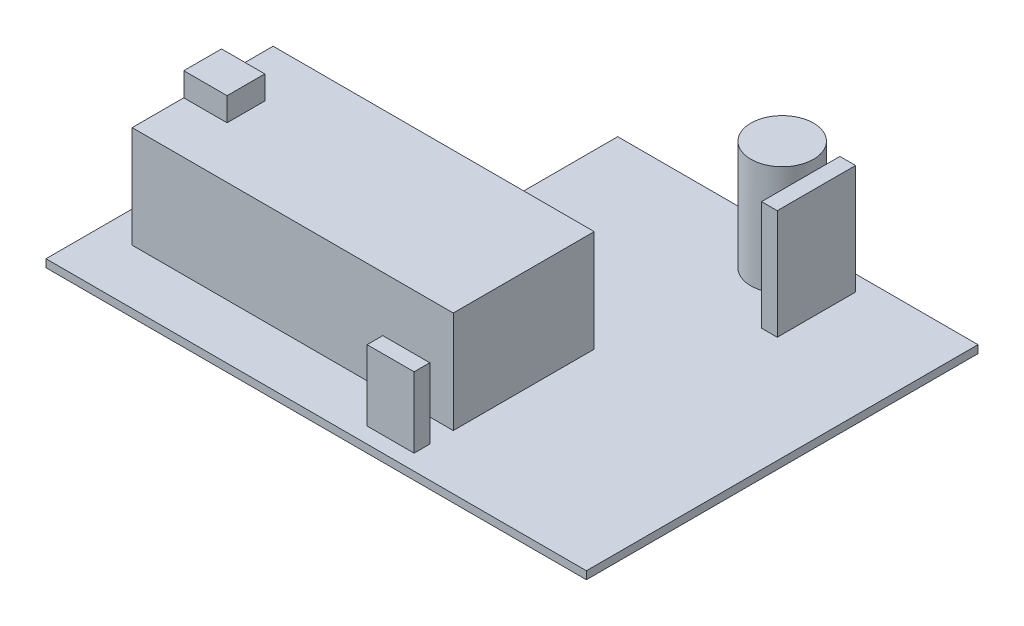
ISO-10303-21;
HEADER;
FILE_DESCRIPTION(('STEP AP214'),'2;1');
FILE_NAME('part.step','',(''),(''),'','','');
FILE_SCHEMA(('AUTOMOTIVE_DESIGN { 1 0 10303 214 1 1 1 1 }'));
ENDSEC;
DATA;
#1=APPLICATION_CONTEXT('core data for automotive mechanical design processes');
#2=APPLICATION_PROTOCOL_DEFINITION('international standard','automotive_design',2000,#1);
#3=PRODUCT_CONTEXT('',#1,'mechanical');
#4=PRODUCT('Part','Part','',(#3));
#5=PRODUCT_RELATED_PRODUCT_CATEGORY('part','',(#4));
#6=PRODUCT_DEFINITION_FORMATION('','',#4);
#7=PRODUCT_DEFINITION_CONTEXT('part definition',#1,'design');
#8=PRODUCT_DEFINITION('design','',#6,#7);
#9=PRODUCT_DEFINITION_SHAPE('','',#8);
#10=(LENGTH_UNIT() NAMED_UNIT(*) SI_UNIT(.MILLI.,.METRE.));
#11=(NAMED_UNIT(*) PLANE_ANGLE_UNIT() SI_UNIT($,.RADIAN.));
#12=(NAMED_UNIT(*) SI_UNIT($,.STERADIAN.) SOLID_ANGLE_UNIT());
#13=UNCERTAINTY_MEASURE_WITH_UNIT(LENGTH_MEASURE(1.E-05),#10,'distance_accuracy_value','');
#14=(GEOMETRIC_REPRESENTATION_CONTEXT(3) GLOBAL_UNCERTAINTY_ASSIGNED_CONTEXT((#13)) GLOBAL_UNIT_ASSIGNED_CONTEXT((#10,
#11,#12)) REPRESENTATION_CONTEXT('',''));
#15=CARTESIAN_POINT('',(0.,0.,0.));
#16=DIRECTION('',(0.,0.,1.));
#17=DIRECTION('',(1.,0.,0.));
#18=AXIS2_PLACEMENT_3D('',#15,#16,#17);
#19=CARTESIAN_POINT('',(0.,1.,0.));
#20=DIRECTION('',(0.,1.,0.));
#21=DIRECTION('',(0.,0.,1.));
#22=AXIS2_PLACEMENT_3D('',#19,#20,#21);
#23=PLANE('',#22);
#24=DIRECTION('',(1.,0.,0.));
#25=VECTOR('',#24,1.);
#26=CARTESIAN_POINT('',(0.,1.,-50.));
#27=LINE('',#26,#25);
#28=CARTESIAN_POINT('',(48.,1.,-50.));
#29=VERTEX_POINT('',#28);
#30=CARTESIAN_POINT('',(69.,1.,-50.));
#31=VERTEX_POINT('',#30);
#32=EDGE_CURVE('E313',#29,#31,#27,.T.);
#33=ORIENTED_EDGE('',*,*,#32,.F.);
#34=CARTESIAN_POINT('',(48.,1.,-46.));
#35=DIRECTION('',(0.,1.,0.));
#36=DIRECTION('',(0.,0.,1.));
#37=AXIS2_PLACEMENT_3D('',#34,#35,#36);
#38=CIRCLE('',#37,4.00000000000001);
#39=EDGE_CURVE('E58',#29,#29,#38,.T.);
#40=ORIENTED_EDGE('',*,*,#39,.F.);
#41=CARTESIAN_POINT('',(23.,1.,-50.));
#42=VERTEX_POINT('',#41);
#43=EDGE_CURVE('E309',#42,#29,#27,.T.);
#44=ORIENTED_EDGE('',*,*,#43,.F.);
#45=DIRECTION('',(0.,0.,1.));
#46=VECTOR('',#45,1.);
#47=CARTESIAN_POINT('',(23.,1.,0.));
#48=LINE('',#47,#46);
#49=CARTESIAN_POINT('',(23.,1.,-32.));
#50=VERTEX_POINT('',#49);
#51=EDGE_CURVE('E312',#42,#50,#48,.T.);
#52=ORIENTED_EDGE('',*,*,#51,.T.);
#53=DIRECTION('',(1.,0.,0.));
#54=VECTOR('',#53,1.);
#55=CARTESIAN_POINT('',(0.,1.,-32.));
#56=LINE('',#55,#54);
#57=CARTESIAN_POINT('',(0.,1.,-32.));
#58=VERTEX_POINT('',#57);
#59=EDGE_CURVE('E315',#58,#50,#56,.T.);
#60=ORIENTED_EDGE('',*,*,#59,.F.);
#61=DIRECTION('',(0.,0.,-1.));
#62=VECTOR('',#61,1.);
#63=CARTESIAN_POINT('',(0.,1.,0.));
#64=LINE('',#63,#62);
#65=CARTESIAN_POINT('',(0.,1.,0.));
#66=VERTEX_POINT('',#65);
#67=EDGE_CURVE('E318',#66,#58,#64,.T.);
#68=ORIENTED_EDGE('',*,*,#67,.F.);
#69=DIRECTION('',(1.,0.,0.));
#70=VECTOR('',#69,1.);
#71=CARTESIAN_POINT('',(0.,1.,0.));
#72=LINE('',#71,#70);
#73=CARTESIAN_POINT('',(69.,1.,0.));
#74=VERTEX_POINT('',#73);
#75=EDGE_CURVE('E321',#66,#74,#72,.T.);
#76=ORIENTED_EDGE('',*,*,#75,.T.);
#77=DIRECTION('',(0.,0.,-1.));
#78=VECTOR('',#77,1.);
#79=CARTESIAN_POINT('',(69.,1.,0.));
#80=LINE('',#79,#78);
#81=EDGE_CURVE('E323',#74,#31,#80,.T.);
#82=ORIENTED_EDGE('',*,*,#81,.T.);
#83=EDGE_LOOP('',(#33,#40,#44,#52,#60,#68,#76,#82));
#84=FACE_BOUND('',#83,.T.);
#85=DIRECTION('',(1.,0.,0.));
#86=VECTOR('',#85,1.);
#87=CARTESIAN_POINT('',(4.,1.,-7.));
#88=LINE('',#87,#86);
#89=CARTESIAN_POINT('',(4.,1.,-7.));
#90=VERTEX_POINT('',#89);
#91=CARTESIAN_POINT('',(45.,1.,-7.));
#92=VERTEX_POINT('',#91);
#93=EDGE_CURVE('E292',#90,#92,#88,.T.);
#94=ORIENTED_EDGE('',*,*,#93,.F.);
#95=DIRECTION('',(0.,0.,1.));
#96=VECTOR('',#95,1.);
#97=CARTESIAN_POINT('',(4.,1.,-25.));
#98=LINE('',#97,#96);
#99=CARTESIAN_POINT('',(4.,1.,-25.));
#100=VERTEX_POINT('',#99);
#101=EDGE_CURVE('E279',#100,#90,#98,.T.);
#102=ORIENTED_EDGE('',*,*,#101,.F.);
#103=DIRECTION('',(-1.,0.,0.));
#104=VECTOR('',#103,1.);
#105=CARTESIAN_POINT('',(4.,1.,-25.));
#106=LINE('',#105,#104);
#107=CARTESIAN_POINT('',(45.,1.,-25.));
#108=VERTEX_POINT('',#107);
#109=EDGE_CURVE('E297',#108,#100,#106,.T.);
#110=ORIENTED_EDGE('',*,*,#109,.F.);
#111=DIRECTION('',(0.,0.,-1.));
#112=VECTOR('',#111,1.);
#113=CARTESIAN_POINT('',(45.,1.,-25.));
#114=LINE('',#113,#112);
#115=EDGE_CURVE('E294',#92,#108,#114,.T.);
#116=ORIENTED_EDGE('',*,*,#115,.F.);
#117=EDGE_LOOP('',(#94,#102,#110,#116));
#118=FACE_BOUND('',#117,.T.);
#119=DIRECTION('',(-1.,0.,0.));
#120=VECTOR('',#119,1.);
#121=CARTESIAN_POINT('',(45.,1.,-4.));
#122=LINE('',#121,#120);
#123=CARTESIAN_POINT('',(45.,1.,-4.));
#124=VERTEX_POINT('',#123);
#125=CARTESIAN_POINT('',(39.,1.,-4.));
#126=VERTEX_POINT('',#125);
#127=EDGE_CURVE('E234',#124,#126,#122,.T.);
#128=ORIENTED_EDGE('',*,*,#127,.F.);
#129=DIRECTION('',(0.,0.,-1.));
#130=VECTOR('',#129,1.);
#131=CARTESIAN_POINT('',(45.,1.,-4.));
#132=LINE('',#131,#130);
#133=CARTESIAN_POINT('',(45.,1.,-2.));
#134=VERTEX_POINT('',#133);
#135=EDGE_CURVE('E219',#134,#124,#132,.T.);
#136=ORIENTED_EDGE('',*,*,#135,.F.);
#137=DIRECTION('',(1.,0.,0.));
#138=VECTOR('',#137,1.);
#139=CARTESIAN_POINT('',(45.,1.,-2.));
#140=LINE('',#139,#138);
#141=CARTESIAN_POINT('',(39.,1.,-2.));
#142=VERTEX_POINT('',#141);
#143=EDGE_CURVE('E225',#142,#134,#140,.T.);
#144=ORIENTED_EDGE('',*,*,#143,.F.);
#145=DIRECTION('',(0.,0.,1.));
#146=VECTOR('',#145,1.);
#147=CARTESIAN_POINT('',(39.,1.,-4.));
#148=LINE('',#147,#146);
#149=EDGE_CURVE('E236',#126,#142,#148,.T.);
#150=ORIENTED_EDGE('',*,*,#149,.F.);
#151=EDGE_LOOP('',(#128,#136,#144,#150));
#152=FACE_BOUND('',#151,.T.);
#153=DIRECTION('',(1.,0.,0.));
#154=VECTOR('',#153,1.);
#155=CARTESIAN_POINT('',(53.3685470889416,1.,-38.));
#156=LINE('',#155,#154);
#157=CARTESIAN_POINT('',(53.3685470889416,1.,-38.));
#158=VERTEX_POINT('',#157);
#159=CARTESIAN_POINT('',(55.3685470889416,1.,-38.));
#160=VERTEX_POINT('',#159);
#161=EDGE_CURVE('E650',#158,#160,#156,.T.);
#162=ORIENTED_EDGE('',*,*,#161,.F.);
#163=DIRECTION('',(0.,0.,1.));
#164=VECTOR('',#163,1.);
#165=CARTESIAN_POINT('',(53.3685470889416,1.,-48.));
#166=LINE('',#165,#164);
#167=CARTESIAN_POINT('',(53.3685470889416,1.,-48.));
#168=VERTEX_POINT('',#167);
#169=EDGE_CURVE('E210',#168,#158,#166,.T.);
#170=ORIENTED_EDGE('',*,*,#169,.F.);
#171=DIRECTION('',(-1.,0.,0.));
#172=VECTOR('',#171,1.);
#173=CARTESIAN_POINT('',(53.3685470889416,1.,-48.));
#174=LINE('',#173,#172);
#175=CARTESIAN_POINT('',(55.3685470889416,1.,-48.));
#176=VERTEX_POINT('',#175);
#177=EDGE_CURVE('E206',#176,#168,#174,.T.);
#178=ORIENTED_EDGE('',*,*,#177,.F.);
#179=DIRECTION('',(0.,0.,-1.));
#180=VECTOR('',#179,1.);
#181=CARTESIAN_POINT('',(55.3685470889416,1.,-48.));
#182=LINE('',#181,#180);
#183=EDGE_CURVE('E647',#160,#176,#182,.T.);
#184=ORIENTED_EDGE('',*,*,#183,.F.);
#185=EDGE_LOOP('',(#162,#170,#178,#184));
#186=FACE_BOUND('',#185,.T.);
#187=ADVANCED_FACE('F37',(#84,#118,#152,#186),#23,.T.);
#188=CARTESIAN_POINT('',(0.,1.,-50.));
#189=DIRECTION('',(0.,0.,-1.));
#190=DIRECTION('',(-1.,0.,0.));
#191=AXIS2_PLACEMENT_3D('',#188,#189,#190);
#192=PLANE('',#191);
#193=DIRECTION('',(1.,0.,0.));
#194=VECTOR('',#193,1.);
#195=CARTESIAN_POINT('',(0.,0.,-50.));
#196=LINE('',#195,#194);
#197=CARTESIAN_POINT('',(23.,0.,-50.));
#198=VERTEX_POINT('',#197);
#199=CARTESIAN_POINT('',(69.,0.,-50.));
#200=VERTEX_POINT('',#199);
#201=EDGE_CURVE('E308',#198,#200,#196,.T.);
#202=ORIENTED_EDGE('',*,*,#201,.F.);
#203=DIRECTION('',(0.,-1.,0.));
#204=VECTOR('',#203,1.);
#205=CARTESIAN_POINT('',(23.,1.,-50.));
#206=LINE('',#205,#204);
#207=EDGE_CURVE('E11',#42,#198,#206,.T.);
#208=ORIENTED_EDGE('',*,*,#207,.F.);
#209=ORIENTED_EDGE('',*,*,#43,.T.);
#210=ORIENTED_EDGE('',*,*,#32,.T.);
#211=DIRECTION('',(0.,-1.,0.));
#212=VECTOR('',#211,1.);
#213=CARTESIAN_POINT('',(69.,1.,-50.));
#214=LINE('',#213,#212);
#215=EDGE_CURVE('E326',#31,#200,#214,.T.);
#216=ORIENTED_EDGE('',*,*,#215,.T.);
#217=EDGE_LOOP('',(#202,#208,#209,#210,#216));
#218=FACE_BOUND('',#217,.T.);
#219=ADVANCED_FACE('F39',(#218),#192,.T.);
#220=CARTESIAN_POINT('',(23.,1.,0.));
#221=DIRECTION('',(1.,0.,0.));
#222=DIRECTION('',(0.,0.,-1.));
#223=AXIS2_PLACEMENT_3D('',#220,#221,#222);
#224=PLANE('',#223);
#225=DIRECTION('',(0.,0.,1.));
#226=VECTOR('',#225,1.);
#227=CARTESIAN_POINT('',(23.,0.,0.));
#228=LINE('',#227,#226);
#229=CARTESIAN_POINT('',(23.,0.,-32.));
#230=VERTEX_POINT('',#229);
#231=EDGE_CURVE('E329',#198,#230,#228,.T.);
#232=ORIENTED_EDGE('',*,*,#231,.T.);
#233=DIRECTION('',(0.,-1.,0.));
#234=VECTOR('',#233,1.);
#235=CARTESIAN_POINT('',(23.,1.,-32.));
#236=LINE('',#235,#234);
#237=EDGE_CURVE('E45',#50,#230,#236,.T.);
#238=ORIENTED_EDGE('',*,*,#237,.F.);
#239=ORIENTED_EDGE('',*,*,#51,.F.);
#240=ORIENTED_EDGE('',*,*,#207,.T.);
#241=EDGE_LOOP('',(#232,#238,#239,#240));
#242=FACE_BOUND('',#241,.T.);
#243=ADVANCED_FACE('F358',(#242),#224,.F.);
#244=CARTESIAN_POINT('',(0.,1.,-32.));
#245=DIRECTION('',(0.,0.,-1.));
#246=DIRECTION('',(-1.,0.,0.));
#247=AXIS2_PLACEMENT_3D('',#244,#245,#246);
#248=PLANE('',#247);
#249=DIRECTION('',(1.,0.,0.));
#250=VECTOR('',#249,1.);
#251=CARTESIAN_POINT('',(0.,0.,-32.));
#252=LINE('',#251,#250);
#253=CARTESIAN_POINT('',(0.,0.,-32.));
#254=VERTEX_POINT('',#253);
#255=EDGE_CURVE('E332',#254,#230,#252,.T.);
#256=ORIENTED_EDGE('',*,*,#255,.F.);
#257=DIRECTION('',(0.,-1.,0.));
#258=VECTOR('',#257,1.);
#259=CARTESIAN_POINT('',(0.,1.,-32.));
#260=LINE('',#259,#258);
#261=EDGE_CURVE('E349',#58,#254,#260,.T.);
#262=ORIENTED_EDGE('',*,*,#261,.F.);
#263=ORIENTED_EDGE('',*,*,#59,.T.);
#264=ORIENTED_EDGE('',*,*,#237,.T.);
#265=EDGE_LOOP('',(#256,#262,#263,#264));
#266=FACE_BOUND('',#265,.T.);
#267=ADVANCED_FACE('F353',(#266),#248,.T.);
#268=CARTESIAN_POINT('',(0.,1.,0.));
#269=DIRECTION('',(-1.,0.,0.));
#270=DIRECTION('',(0.,0.,1.));
#271=AXIS2_PLACEMENT_3D('',#268,#269,#270);
#272=PLANE('',#271);
#273=DIRECTION('',(0.,0.,-1.));
#274=VECTOR('',#273,1.);
#275=CARTESIAN_POINT('',(0.,0.,0.));
#276=LINE('',#275,#274);
#277=CARTESIAN_POINT('',(0.,0.,0.));
#278=VERTEX_POINT('',#277);
#279=EDGE_CURVE('E335',#278,#254,#276,.T.);
#280=ORIENTED_EDGE('',*,*,#279,.F.);
#281=DIRECTION('',(0.,-1.,0.));
#282=VECTOR('',#281,1.);
#283=CARTESIAN_POINT('',(0.,1.,0.));
#284=LINE('',#283,#282);
#285=EDGE_CURVE('E347',#66,#278,#284,.T.);
#286=ORIENTED_EDGE('',*,*,#285,.F.);
#287=ORIENTED_EDGE('',*,*,#67,.T.);
#288=ORIENTED_EDGE('',*,*,#261,.T.);
#289=EDGE_LOOP('',(#280,#286,#287,#288));
#290=FACE_BOUND('',#289,.T.);
#291=ADVANCED_FACE('F366',(#290),#272,.T.);
#292=CARTESIAN_POINT('',(0.,1.,0.));
#293=DIRECTION('',(0.,0.,-1.));
#294=DIRECTION('',(-1.,0.,0.));
#295=AXIS2_PLACEMENT_3D('',#292,#293,#294);
#296=PLANE('',#295);
#297=DIRECTION('',(1.,0.,0.));
#298=VECTOR('',#297,1.);
#299=CARTESIAN_POINT('',(0.,0.,0.));
#300=LINE('',#299,#298);
#301=CARTESIAN_POINT('',(69.,0.,0.));
#302=VERTEX_POINT('',#301);
#303=EDGE_CURVE('E338',#278,#302,#300,.T.);
#304=ORIENTED_EDGE('',*,*,#303,.T.);
#305=DIRECTION('',(0.,-1.,0.));
#306=VECTOR('',#305,1.);
#307=CARTESIAN_POINT('',(69.,1.,0.));
#308=LINE('',#307,#306);
#309=EDGE_CURVE('E344',#74,#302,#308,.T.);
#310=ORIENTED_EDGE('',*,*,#309,.F.);
#311=ORIENTED_EDGE('',*,*,#75,.F.);
#312=ORIENTED_EDGE('',*,*,#285,.T.);
#313=EDGE_LOOP('',(#304,#310,#311,#312));
#314=FACE_BOUND('',#313,.T.);
#315=ADVANCED_FACE('F380',(#314),#296,.F.);
#316=CARTESIAN_POINT('',(69.,1.,0.));
#317=DIRECTION('',(-1.,0.,0.));
#318=DIRECTION('',(0.,0.,1.));
#319=AXIS2_PLACEMENT_3D('',#316,#317,#318);
#320=PLANE('',#319);
#321=DIRECTION('',(0.,0.,-1.));
#322=VECTOR('',#321,1.);
#323=CARTESIAN_POINT('',(69.,0.,0.));
#324=LINE('',#323,#322);
#325=EDGE_CURVE('E340',#302,#200,#324,.T.);
#326=ORIENTED_EDGE('',*,*,#325,.T.);
#327=ORIENTED_EDGE('',*,*,#215,.F.);
#328=ORIENTED_EDGE('',*,*,#81,.F.);
#329=ORIENTED_EDGE('',*,*,#309,.T.);
#330=EDGE_LOOP('',(#326,#327,#328,#329));
#331=FACE_BOUND('',#330,.T.);
#332=ADVANCED_FACE('F376',(#331),#320,.F.);
#333=CARTESIAN_POINT('',(0.,0.,0.));
#334=DIRECTION('',(0.,1.,0.));
#335=DIRECTION('',(0.,0.,1.));
#336=AXIS2_PLACEMENT_3D('',#333,#334,#335);
#337=PLANE('',#336);
#338=ORIENTED_EDGE('',*,*,#201,.T.);
#339=ORIENTED_EDGE('',*,*,#325,.F.);
#340=ORIENTED_EDGE('',*,*,#303,.F.);
#341=ORIENTED_EDGE('',*,*,#279,.T.);
#342=ORIENTED_EDGE('',*,*,#255,.T.);
#343=ORIENTED_EDGE('',*,*,#231,.F.);
#344=EDGE_LOOP('',(#338,#339,#340,#341,#342,#343));
#345=FACE_BOUND('',#344,.T.);
#346=ADVANCED_FACE('F361',(#345),#337,.F.);
#347=CARTESIAN_POINT('',(4.,14.,-25.));
#348=DIRECTION('',(1.,0.,0.));
#349=DIRECTION('',(0.,0.,-1.));
#350=AXIS2_PLACEMENT_3D('',#347,#348,#349);
#351=PLANE('',#350);
#352=ORIENTED_EDGE('',*,*,#101,.T.);
#353=DIRECTION('',(0.,-1.,0.));
#354=VECTOR('',#353,1.);
#355=CARTESIAN_POINT('',(4.,14.,-7.));
#356=LINE('',#355,#354);
#357=CARTESIAN_POINT('',(4.,14.,-7.));
#358=VERTEX_POINT('',#357);
#359=EDGE_CURVE('E306',#358,#90,#356,.T.);
#360=ORIENTED_EDGE('',*,*,#359,.F.);
#361=DIRECTION('',(0.,0.,1.));
#362=VECTOR('',#361,1.);
#363=CARTESIAN_POINT('',(4.,14.,-25.));
#364=LINE('',#363,#362);
#365=CARTESIAN_POINT('',(4.,14.,-13.5914102064778));
#366=VERTEX_POINT('',#365);
#367=EDGE_CURVE('E283',#366,#358,#364,.T.);
#368=ORIENTED_EDGE('',*,*,#367,.F.);
#369=DIRECTION('',(0.,-1.,0.));
#370=VECTOR('',#369,1.);
#371=CARTESIAN_POINT('',(4.,17.,-13.5914102064778));
#372=LINE('',#371,#370);
#373=CARTESIAN_POINT('',(4.,17.,-13.5914102064778));
#374=VERTEX_POINT('',#373);
#375=EDGE_CURVE('E276',#374,#366,#372,.T.);
#376=ORIENTED_EDGE('',*,*,#375,.F.);
#377=DIRECTION('',(0.,0.,1.));
#378=VECTOR('',#377,1.);
#379=CARTESIAN_POINT('',(4.,17.,-18.4085897935222));
#380=LINE('',#379,#378);
#381=CARTESIAN_POINT('',(4.,17.,-18.4085897935222));
#382=VERTEX_POINT('',#381);
#383=EDGE_CURVE('E250',#382,#374,#380,.T.);
#384=ORIENTED_EDGE('',*,*,#383,.F.);
#385=DIRECTION('',(0.,-1.,0.));
#386=VECTOR('',#385,1.);
#387=CARTESIAN_POINT('',(4.,17.,-18.4085897935222));
#388=LINE('',#387,#386);
#389=CARTESIAN_POINT('',(4.,14.,-18.4085897935222));
#390=VERTEX_POINT('',#389);
#391=EDGE_CURVE('E260',#382,#390,#388,.T.);
#392=ORIENTED_EDGE('',*,*,#391,.T.);
#393=CARTESIAN_POINT('',(4.,14.,-25.));
#394=VERTEX_POINT('',#393);
#395=EDGE_CURVE('E280',#394,#390,#364,.T.);
#396=ORIENTED_EDGE('',*,*,#395,.F.);
#397=DIRECTION('',(0.,-1.,0.));
#398=VECTOR('',#397,1.);
#399=CARTESIAN_POINT('',(4.,14.,-25.));
#400=LINE('',#399,#398);
#401=EDGE_CURVE('E289',#394,#100,#400,.T.);
#402=ORIENTED_EDGE('',*,*,#401,.T.);
#403=EDGE_LOOP('',(#352,#360,#368,#376,#384,#392,#396,#402));
#404=FACE_BOUND('',#403,.T.);
#405=ADVANCED_FACE('F396',(#404),#351,.F.);
#406=CARTESIAN_POINT('',(4.,14.,-7.));
#407=DIRECTION('',(0.,0.,-1.));
#408=DIRECTION('',(-1.,0.,0.));
#409=AXIS2_PLACEMENT_3D('',#406,#407,#408);
#410=PLANE('',#409);
#411=ORIENTED_EDGE('',*,*,#93,.T.);
#412=DIRECTION('',(0.,-1.,0.));
#413=VECTOR('',#412,1.);
#414=CARTESIAN_POINT('',(45.,14.,-7.));
#415=LINE('',#414,#413);
#416=CARTESIAN_POINT('',(45.,14.,-7.));
#417=VERTEX_POINT('',#416);
#418=EDGE_CURVE('E303',#417,#92,#415,.T.);
#419=ORIENTED_EDGE('',*,*,#418,.F.);
#420=DIRECTION('',(1.,0.,0.));
#421=VECTOR('',#420,1.);
#422=CARTESIAN_POINT('',(4.,14.,-7.));
#423=LINE('',#422,#421);
#424=EDGE_CURVE('E282',#358,#417,#423,.T.);
#425=ORIENTED_EDGE('',*,*,#424,.F.);
#426=ORIENTED_EDGE('',*,*,#359,.T.);
#427=EDGE_LOOP('',(#411,#419,#425,#426));
#428=FACE_BOUND('',#427,.T.);
#429=ADVANCED_FACE('F402',(#428),#410,.F.);
#430=CARTESIAN_POINT('',(45.,14.,-25.));
#431=DIRECTION('',(-1.,0.,0.));
#432=DIRECTION('',(0.,0.,1.));
#433=AXIS2_PLACEMENT_3D('',#430,#431,#432);
#434=PLANE('',#433);
#435=ORIENTED_EDGE('',*,*,#115,.T.);
#436=DIRECTION('',(0.,-1.,0.));
#437=VECTOR('',#436,1.);
#438=CARTESIAN_POINT('',(45.,14.,-25.));
#439=LINE('',#438,#437);
#440=CARTESIAN_POINT('',(45.,14.,-25.));
#441=VERTEX_POINT('',#440);
#442=EDGE_CURVE('E301',#441,#108,#439,.T.);
#443=ORIENTED_EDGE('',*,*,#442,.F.);
#444=DIRECTION('',(0.,0.,-1.));
#445=VECTOR('',#444,1.);
#446=CARTESIAN_POINT('',(45.,14.,-25.));
#447=LINE('',#446,#445);
#448=EDGE_CURVE('E285',#417,#441,#447,.T.);
#449=ORIENTED_EDGE('',*,*,#448,.F.);
#450=ORIENTED_EDGE('',*,*,#418,.T.);
#451=EDGE_LOOP('',(#435,#443,#449,#450));
#452=FACE_BOUND('',#451,.T.);
#453=ADVANCED_FACE('F407',(#452),#434,.F.);
#454=CARTESIAN_POINT('',(4.,14.,-25.));
#455=DIRECTION('',(0.,0.,1.));
#456=DIRECTION('',(1.,0.,0.));
#457=AXIS2_PLACEMENT_3D('',#454,#455,#456);
#458=PLANE('',#457);
#459=ORIENTED_EDGE('',*,*,#109,.T.);
#460=ORIENTED_EDGE('',*,*,#401,.F.);
#461=DIRECTION('',(-1.,0.,0.));
#462=VECTOR('',#461,1.);
#463=CARTESIAN_POINT('',(4.,14.,-25.));
#464=LINE('',#463,#462);
#465=EDGE_CURVE('E287',#441,#394,#464,.T.);
#466=ORIENTED_EDGE('',*,*,#465,.F.);
#467=ORIENTED_EDGE('',*,*,#442,.T.);
#468=EDGE_LOOP('',(#459,#460,#466,#467));
#469=FACE_BOUND('',#468,.T.);
#470=ADVANCED_FACE('F453',(#469),#458,.F.);
#471=CARTESIAN_POINT('',(0.,14.,0.));
#472=DIRECTION('',(0.,1.,0.));
#473=DIRECTION('',(0.,0.,1.));
#474=AXIS2_PLACEMENT_3D('',#471,#472,#473);
#475=PLANE('',#474);
#476=DIRECTION('',(-1.,0.,0.));
#477=VECTOR('',#476,1.);
#478=CARTESIAN_POINT('',(4.,14.,-18.4085897935222));
#479=LINE('',#478,#477);
#480=CARTESIAN_POINT('',(9.52799134150682,14.,-18.4085897935222));
#481=VERTEX_POINT('',#480);
#482=EDGE_CURVE('E254',#481,#390,#479,.T.);
#483=ORIENTED_EDGE('',*,*,#482,.F.);
#484=DIRECTION('',(0.,0.,-1.));
#485=VECTOR('',#484,1.);
#486=CARTESIAN_POINT('',(9.52799134150682,14.,-18.4085897935222));
#487=LINE('',#486,#485);
#488=CARTESIAN_POINT('',(9.52799134150682,14.,-13.5914102064778));
#489=VERTEX_POINT('',#488);
#490=EDGE_CURVE('E263',#489,#481,#487,.T.);
#491=ORIENTED_EDGE('',*,*,#490,.F.);
#492=DIRECTION('',(1.,0.,0.));
#493=VECTOR('',#492,1.);
#494=CARTESIAN_POINT('',(4.,14.,-13.5914102064778));
#495=LINE('',#494,#493);
#496=EDGE_CURVE('E249',#366,#489,#495,.T.);
#497=ORIENTED_EDGE('',*,*,#496,.F.);
#498=ORIENTED_EDGE('',*,*,#367,.T.);
#499=ORIENTED_EDGE('',*,*,#424,.T.);
#500=ORIENTED_EDGE('',*,*,#448,.T.);
#501=ORIENTED_EDGE('',*,*,#465,.T.);
#502=ORIENTED_EDGE('',*,*,#395,.T.);
#503=EDGE_LOOP('',(#483,#491,#497,#498,#499,#500,#501,#502));
#504=FACE_BOUND('',#503,.T.);
#505=ADVANCED_FACE('F425',(#504),#475,.T.);
#506=CARTESIAN_POINT('',(4.,17.,-13.5914102064778));
#507=DIRECTION('',(0.,0.,-1.));
#508=DIRECTION('',(-1.,0.,0.));
#509=AXIS2_PLACEMENT_3D('',#506,#507,#508);
#510=PLANE('',#509);
#511=ORIENTED_EDGE('',*,*,#496,.T.);
#512=DIRECTION('',(0.,-1.,0.));
#513=VECTOR('',#512,1.);
#514=CARTESIAN_POINT('',(9.52799134150682,17.,-13.5914102064778));
#515=LINE('',#514,#513);
#516=CARTESIAN_POINT('',(9.52799134150682,17.,-13.5914102064778));
#517=VERTEX_POINT('',#516);
#518=EDGE_CURVE('E273',#517,#489,#515,.T.);
#519=ORIENTED_EDGE('',*,*,#518,.F.);
#520=DIRECTION('',(1.,0.,0.));
#521=VECTOR('',#520,1.);
#522=CARTESIAN_POINT('',(4.,17.,-13.5914102064778));
#523=LINE('',#522,#521);
#524=EDGE_CURVE('E253',#374,#517,#523,.T.);
#525=ORIENTED_EDGE('',*,*,#524,.F.);
#526=ORIENTED_EDGE('',*,*,#375,.T.);
#527=EDGE_LOOP('',(#511,#519,#525,#526));
#528=FACE_BOUND('',#527,.T.);
#529=ADVANCED_FACE('F429',(#528),#510,.F.);
#530=CARTESIAN_POINT('',(9.52799134150682,17.,-18.4085897935222));
#531=DIRECTION('',(-1.,0.,0.));
#532=DIRECTION('',(0.,0.,1.));
#533=AXIS2_PLACEMENT_3D('',#530,#531,#532);
#534=PLANE('',#533);
#535=ORIENTED_EDGE('',*,*,#490,.T.);
#536=DIRECTION('',(0.,-1.,0.));
#537=VECTOR('',#536,1.);
#538=CARTESIAN_POINT('',(9.52799134150682,17.,-18.4085897935222));
#539=LINE('',#538,#537);
#540=CARTESIAN_POINT('',(9.52799134150682,17.,-18.4085897935222));
#541=VERTEX_POINT('',#540);
#542=EDGE_CURVE('E270',#541,#481,#539,.T.);
#543=ORIENTED_EDGE('',*,*,#542,.F.);
#544=DIRECTION('',(0.,0.,-1.));
#545=VECTOR('',#544,1.);
#546=CARTESIAN_POINT('',(9.52799134150682,17.,-18.4085897935222));
#547=LINE('',#546,#545);
#548=EDGE_CURVE('E256',#517,#541,#547,.T.);
#549=ORIENTED_EDGE('',*,*,#548,.F.);
#550=ORIENTED_EDGE('',*,*,#518,.T.);
#551=EDGE_LOOP('',(#535,#543,#549,#550));
#552=FACE_BOUND('',#551,.T.);
#553=ADVANCED_FACE('F440',(#552),#534,.F.);
#554=CARTESIAN_POINT('',(4.,17.,-18.4085897935222));
#555=DIRECTION('',(0.,0.,1.));
#556=DIRECTION('',(1.,0.,0.));
#557=AXIS2_PLACEMENT_3D('',#554,#555,#556);
#558=PLANE('',#557);
#559=ORIENTED_EDGE('',*,*,#482,.T.);
#560=ORIENTED_EDGE('',*,*,#391,.F.);
#561=DIRECTION('',(-1.,0.,0.));
#562=VECTOR('',#561,1.);
#563=CARTESIAN_POINT('',(4.,17.,-18.4085897935222));
#564=LINE('',#563,#562);
#565=EDGE_CURVE('E258',#541,#382,#564,.T.);
#566=ORIENTED_EDGE('',*,*,#565,.F.);
#567=ORIENTED_EDGE('',*,*,#542,.T.);
#568=EDGE_LOOP('',(#559,#560,#566,#567));
#569=FACE_BOUND('',#568,.T.);
#570=ADVANCED_FACE('F437',(#569),#558,.F.);
#571=CARTESIAN_POINT('',(0.,17.,0.));
#572=DIRECTION('',(0.,1.,0.));
#573=DIRECTION('',(0.,0.,1.));
#574=AXIS2_PLACEMENT_3D('',#571,#572,#573);
#575=PLANE('',#574);
#576=ORIENTED_EDGE('',*,*,#383,.T.);
#577=ORIENTED_EDGE('',*,*,#524,.T.);
#578=ORIENTED_EDGE('',*,*,#548,.T.);
#579=ORIENTED_EDGE('',*,*,#565,.T.);
#580=EDGE_LOOP('',(#576,#577,#578,#579));
#581=FACE_BOUND('',#580,.T.);
#582=ADVANCED_FACE('F433',(#581),#575,.T.);
#583=CARTESIAN_POINT('',(45.,10.,-4.));
#584=DIRECTION('',(-1.,0.,0.));
#585=DIRECTION('',(0.,0.,1.));
#586=AXIS2_PLACEMENT_3D('',#583,#584,#585);
#587=PLANE('',#586);
#588=ORIENTED_EDGE('',*,*,#135,.T.);
#589=DIRECTION('',(0.,-1.,0.));
#590=VECTOR('',#589,1.);
#591=CARTESIAN_POINT('',(45.,10.,-4.));
#592=LINE('',#591,#590);
#593=CARTESIAN_POINT('',(45.,10.,-4.));
#594=VERTEX_POINT('',#593);
#595=EDGE_CURVE('E247',#594,#124,#592,.T.);
#596=ORIENTED_EDGE('',*,*,#595,.F.);
#597=DIRECTION('',(0.,0.,-1.));
#598=VECTOR('',#597,1.);
#599=CARTESIAN_POINT('',(45.,10.,-4.));
#600=LINE('',#599,#598);
#601=CARTESIAN_POINT('',(45.,10.,-2.));
#602=VERTEX_POINT('',#601);
#603=EDGE_CURVE('E221',#602,#594,#600,.T.);
#604=ORIENTED_EDGE('',*,*,#603,.F.);
#605=DIRECTION('',(0.,-1.,0.));
#606=VECTOR('',#605,1.);
#607=CARTESIAN_POINT('',(45.,10.,-2.));
#608=LINE('',#607,#606);
#609=EDGE_CURVE('E231',#602,#134,#608,.T.);
#610=ORIENTED_EDGE('',*,*,#609,.T.);
#611=EDGE_LOOP('',(#588,#596,#604,#610));
#612=FACE_BOUND('',#611,.T.);
#613=ADVANCED_FACE('F498',(#612),#587,.F.);
#614=CARTESIAN_POINT('',(45.,10.,-4.));
#615=DIRECTION('',(0.,0.,1.));
#616=DIRECTION('',(1.,0.,0.));
#617=AXIS2_PLACEMENT_3D('',#614,#615,#616);
#618=PLANE('',#617);
#619=ORIENTED_EDGE('',*,*,#127,.T.);
#620=DIRECTION('',(0.,-1.,0.));
#621=VECTOR('',#620,1.);
#622=CARTESIAN_POINT('',(39.,10.,-4.));
#623=LINE('',#622,#621);
#624=CARTESIAN_POINT('',(39.,10.,-4.));
#625=VERTEX_POINT('',#624);
#626=EDGE_CURVE('E244',#625,#126,#623,.T.);
#627=ORIENTED_EDGE('',*,*,#626,.F.);
#628=DIRECTION('',(-1.,0.,0.));
#629=VECTOR('',#628,1.);
#630=CARTESIAN_POINT('',(45.,10.,-4.));
#631=LINE('',#630,#629);
#632=EDGE_CURVE('E224',#594,#625,#631,.T.);
#633=ORIENTED_EDGE('',*,*,#632,.F.);
#634=ORIENTED_EDGE('',*,*,#595,.T.);
#635=EDGE_LOOP('',(#619,#627,#633,#634));
#636=FACE_BOUND('',#635,.T.);
#637=ADVANCED_FACE('F507',(#636),#618,.F.);
#638=CARTESIAN_POINT('',(39.,10.,-4.));
#639=DIRECTION('',(1.,0.,0.));
#640=DIRECTION('',(0.,0.,-1.));
#641=AXIS2_PLACEMENT_3D('',#638,#639,#640);
#642=PLANE('',#641);
#643=ORIENTED_EDGE('',*,*,#149,.T.);
#644=DIRECTION('',(0.,-1.,0.));
#645=VECTOR('',#644,1.);
#646=CARTESIAN_POINT('',(39.,10.,-2.));
#647=LINE('',#646,#645);
#648=CARTESIAN_POINT('',(39.,10.,-2.));
#649=VERTEX_POINT('',#648);
#650=EDGE_CURVE('E242',#649,#142,#647,.T.);
#651=ORIENTED_EDGE('',*,*,#650,.F.);
#652=DIRECTION('',(0.,0.,1.));
#653=VECTOR('',#652,1.);
#654=CARTESIAN_POINT('',(39.,10.,-4.));
#655=LINE('',#654,#653);
#656=EDGE_CURVE('E227',#625,#649,#655,.T.);
#657=ORIENTED_EDGE('',*,*,#656,.F.);
#658=ORIENTED_EDGE('',*,*,#626,.T.);
#659=EDGE_LOOP('',(#643,#651,#657,#658));
#660=FACE_BOUND('',#659,.T.);
#661=ADVANCED_FACE('F519',(#660),#642,.F.);
#662=CARTESIAN_POINT('',(45.,10.,-2.));
#663=DIRECTION('',(0.,0.,-1.));
#664=DIRECTION('',(-1.,0.,0.));
#665=AXIS2_PLACEMENT_3D('',#662,#663,#664);
#666=PLANE('',#665);
#667=ORIENTED_EDGE('',*,*,#143,.T.);
#668=ORIENTED_EDGE('',*,*,#609,.F.);
#669=DIRECTION('',(1.,0.,0.));
#670=VECTOR('',#669,1.);
#671=CARTESIAN_POINT('',(45.,10.,-2.));
#672=LINE('',#671,#670);
#673=EDGE_CURVE('E229',#649,#602,#672,.T.);
#674=ORIENTED_EDGE('',*,*,#673,.F.);
#675=ORIENTED_EDGE('',*,*,#650,.T.);
#676=EDGE_LOOP('',(#667,#668,#674,#675));
#677=FACE_BOUND('',#676,.T.);
#678=ADVANCED_FACE('F529',(#677),#666,.F.);
#679=CARTESIAN_POINT('',(0.,10.,0.));
#680=DIRECTION('',(0.,-1.,0.));
#681=DIRECTION('',(0.,0.,-1.));
#682=AXIS2_PLACEMENT_3D('',#679,#680,#681);
#683=PLANE('',#682);
#684=ORIENTED_EDGE('',*,*,#603,.T.);
#685=ORIENTED_EDGE('',*,*,#632,.T.);
#686=ORIENTED_EDGE('',*,*,#656,.T.);
#687=ORIENTED_EDGE('',*,*,#673,.T.);
#688=EDGE_LOOP('',(#684,#685,#686,#687));
#689=FACE_BOUND('',#688,.T.);
#690=ADVANCED_FACE('F540',(#689),#683,.F.);
#691=CARTESIAN_POINT('',(48.,15.,-46.));
#692=DIRECTION('',(0.,-1.,0.));
#693=DIRECTION('',(0.,0.,-1.));
#694=AXIS2_PLACEMENT_3D('',#691,#692,#693);
#695=CYLINDRICAL_SURFACE('',#694,4.00000000000001);
#696=CARTESIAN_POINT('',(48.,15.,-46.));
#697=DIRECTION('',(0.,1.,0.));
#698=DIRECTION('',(0.,0.,1.));
#699=AXIS2_PLACEMENT_3D('',#696,#697,#698);
#700=CIRCLE('',#699,4.00000000000001);
#701=CARTESIAN_POINT('',(48.,15.,-42.));
#702=VERTEX_POINT('',#701);
#703=EDGE_CURVE('E213',#702,#702,#700,.T.);
#704=ORIENTED_EDGE('',*,*,#703,.F.);
#705=EDGE_LOOP('',(#704));
#706=FACE_BOUND('',#705,.T.);
#707=ORIENTED_EDGE('',*,*,#39,.T.);
#708=EDGE_LOOP('',(#707));
#709=FACE_BOUND('',#708,.T.);
#710=ADVANCED_FACE('F551',(#706,#709),#695,.T.);
#711=CARTESIAN_POINT('',(48.,15.,-46.));
#712=DIRECTION('',(0.,1.,0.));
#713=DIRECTION('',(0.,0.,1.));
#714=AXIS2_PLACEMENT_3D('',#711,#712,#713);
#715=PLANE('',#714);
#716=ORIENTED_EDGE('',*,*,#703,.T.);
#717=EDGE_LOOP('',(#716));
#718=FACE_BOUND('',#717,.T.);
#719=ADVANCED_FACE('F570',(#718),#715,.T.);
#720=CARTESIAN_POINT('',(53.3685470889416,15.,-48.));
#721=DIRECTION('',(1.,0.,0.));
#722=DIRECTION('',(0.,0.,-1.));
#723=AXIS2_PLACEMENT_3D('',#720,#721,#722);
#724=PLANE('',#723);
#725=ORIENTED_EDGE('',*,*,#169,.T.);
#726=DIRECTION('',(0.,-1.,0.));
#727=VECTOR('',#726,1.);
#728=CARTESIAN_POINT('',(53.3685470889416,15.,-38.));
#729=LINE('',#728,#727);
#730=CARTESIAN_POINT('',(53.3685470889416,15.,-38.));
#731=VERTEX_POINT('',#730);
#732=EDGE_CURVE('E191',#731,#158,#729,.T.);
#733=ORIENTED_EDGE('',*,*,#732,.F.);
#734=DIRECTION('',(0.,0.,1.));
#735=VECTOR('',#734,1.);
#736=CARTESIAN_POINT('',(53.3685470889416,15.,-48.));
#737=LINE('',#736,#735);
#738=CARTESIAN_POINT('',(53.3685470889416,15.,-48.));
#739=VERTEX_POINT('',#738);
#740=EDGE_CURVE('E198',#739,#731,#737,.T.);
#741=ORIENTED_EDGE('',*,*,#740,.F.);
#742=DIRECTION('',(0.,-1.,0.));
#743=VECTOR('',#742,1.);
#744=CARTESIAN_POINT('',(53.3685470889416,15.,-48.));
#745=LINE('',#744,#743);
#746=EDGE_CURVE('E644',#739,#168,#745,.T.);
#747=ORIENTED_EDGE('',*,*,#746,.T.);
#748=EDGE_LOOP('',(#725,#733,#741,#747));
#749=FACE_BOUND('',#748,.T.);
#750=ADVANCED_FACE('F208',(#749),#724,.F.);
#751=CARTESIAN_POINT('',(53.3685470889416,15.,-38.));
#752=DIRECTION('',(0.,0.,-1.));
#753=DIRECTION('',(-1.,0.,0.));
#754=AXIS2_PLACEMENT_3D('',#751,#752,#753);
#755=PLANE('',#754);
#756=ORIENTED_EDGE('',*,*,#161,.T.);
#757=DIRECTION('',(0.,-1.,0.));
#758=VECTOR('',#757,1.);
#759=CARTESIAN_POINT('',(55.3685470889416,15.,-38.));
#760=LINE('',#759,#758);
#761=CARTESIAN_POINT('',(55.3685470889416,15.,-38.));
#762=VERTEX_POINT('',#761);
#763=EDGE_CURVE('E194',#762,#160,#760,.T.);
#764=ORIENTED_EDGE('',*,*,#763,.F.);
#765=DIRECTION('',(1.,0.,0.));
#766=VECTOR('',#765,1.);
#767=CARTESIAN_POINT('',(53.3685470889416,15.,-38.));
#768=LINE('',#767,#766);
#769=EDGE_CURVE('E187',#731,#762,#768,.T.);
#770=ORIENTED_EDGE('',*,*,#769,.F.);
#771=ORIENTED_EDGE('',*,*,#732,.T.);
#772=EDGE_LOOP('',(#756,#764,#770,#771));
#773=FACE_BOUND('',#772,.T.);
#774=ADVANCED_FACE('F189',(#773),#755,.F.);
#775=CARTESIAN_POINT('',(55.3685470889416,15.,-48.));
#776=DIRECTION('',(-1.,0.,0.));
#777=DIRECTION('',(0.,0.,1.));
#778=AXIS2_PLACEMENT_3D('',#775,#776,#777);
#779=PLANE('',#778);
#780=ORIENTED_EDGE('',*,*,#183,.T.);
#781=DIRECTION('',(0.,-1.,0.));
#782=VECTOR('',#781,1.);
#783=CARTESIAN_POINT('',(55.3685470889416,15.,-48.));
#784=LINE('',#783,#782);
#785=CARTESIAN_POINT('',(55.3685470889416,15.,-48.));
#786=VERTEX_POINT('',#785);
#787=EDGE_CURVE('E52',#786,#176,#784,.T.);
#788=ORIENTED_EDGE('',*,*,#787,.F.);
#789=DIRECTION('',(0.,0.,-1.));
#790=VECTOR('',#789,1.);
#791=CARTESIAN_POINT('',(55.3685470889416,15.,-48.));
#792=LINE('',#791,#790);
#793=EDGE_CURVE('E197',#762,#786,#792,.T.);
#794=ORIENTED_EDGE('',*,*,#793,.F.);
#795=ORIENTED_EDGE('',*,*,#763,.T.);
#796=EDGE_LOOP('',(#780,#788,#794,#795));
#797=FACE_BOUND('',#796,.T.);
#798=ADVANCED_FACE('F608',(#797),#779,.F.);
#799=CARTESIAN_POINT('',(53.3685470889416,15.,-48.));
#800=DIRECTION('',(0.,0.,1.));
#801=DIRECTION('',(1.,0.,0.));
#802=AXIS2_PLACEMENT_3D('',#799,#800,#801);
#803=PLANE('',#802);
#804=ORIENTED_EDGE('',*,*,#177,.T.);
#805=ORIENTED_EDGE('',*,*,#746,.F.);
#806=DIRECTION('',(-1.,0.,0.));
#807=VECTOR('',#806,1.);
#808=CARTESIAN_POINT('',(53.3685470889416,15.,-48.));
#809=LINE('',#808,#807);
#810=EDGE_CURVE('E202',#786,#739,#809,.T.);
#811=ORIENTED_EDGE('',*,*,#810,.F.);
#812=ORIENTED_EDGE('',*,*,#787,.T.);
#813=EDGE_LOOP('',(#804,#805,#811,#812));
#814=FACE_BOUND('',#813,.T.);
#815=ADVANCED_FACE('F617',(#814),#803,.F.);
#816=CARTESIAN_POINT('',(0.,15.,0.));
#817=DIRECTION('',(0.,1.,0.));
#818=DIRECTION('',(0.,0.,1.));
#819=AXIS2_PLACEMENT_3D('',#816,#817,#818);
#820=PLANE('',#819);
#821=ORIENTED_EDGE('',*,*,#740,.T.);
#822=ORIENTED_EDGE('',*,*,#769,.T.);
#823=ORIENTED_EDGE('',*,*,#793,.T.);
#824=ORIENTED_EDGE('',*,*,#810,.T.);
#825=EDGE_LOOP('',(#821,#822,#823,#824));
#826=FACE_BOUND('',#825,.T.);
#827=ADVANCED_FACE('F201',(#826),#820,.T.);
#828=CLOSED_SHELL('',(#187,#219,#243,#267,#291,#315,#332,#346,#405,#429,#453,#470,#505,#529,
#553,#570,#582,#613,#637,#661,#678,#690,#710,#719,#750,#774,#798,#815,#827));
#829=MANIFOLD_SOLID_BREP('B2',#828);
#830=ADVANCED_BREP_SHAPE_REPRESENTATION('',(#18,#829),#14);
#831=SHAPE_DEFINITION_REPRESENTATION(#9,#830);
ENDSEC;
END-ISO-10303-21;
